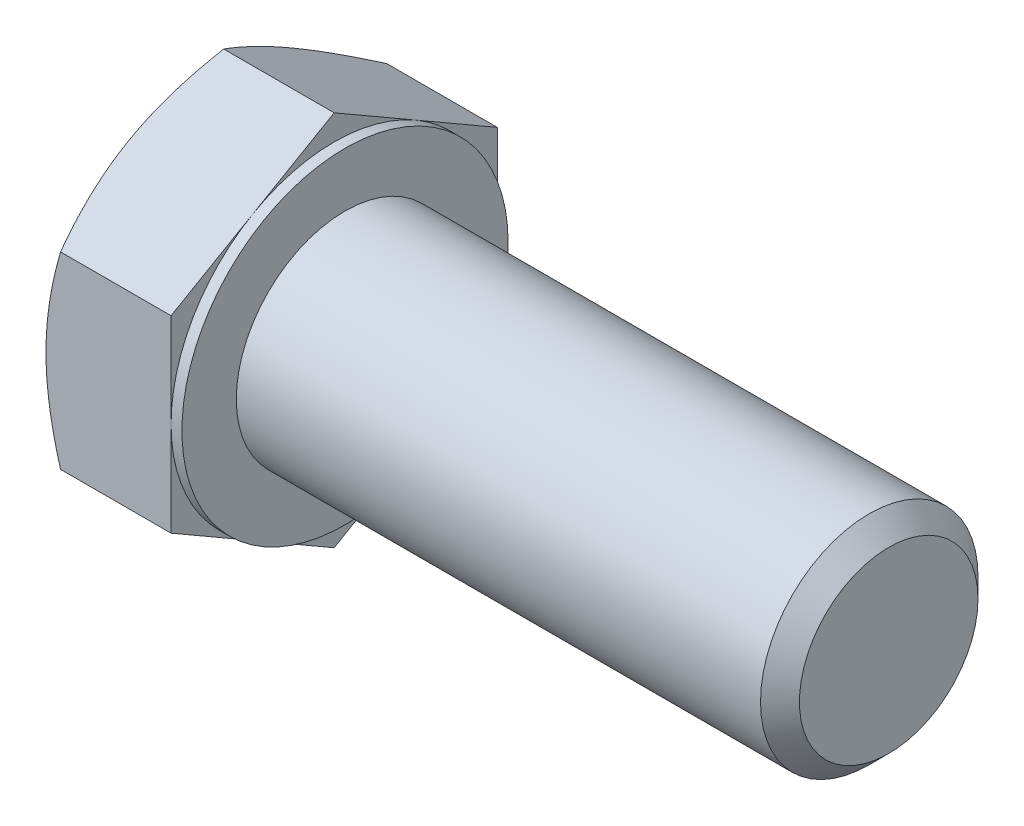
ISO-10303-21;
HEADER;
FILE_DESCRIPTION(('STEP AP214'),'2;1');
FILE_NAME('part.step','',(''),(''),'','','');
FILE_SCHEMA(('AUTOMOTIVE_DESIGN { 1 0 10303 214 1 1 1 1 }'));
ENDSEC;
DATA;
#1=APPLICATION_CONTEXT('core data for automotive mechanical design processes');
#2=APPLICATION_PROTOCOL_DEFINITION('international standard','automotive_design',2000,#1);
#3=PRODUCT_CONTEXT('',#1,'mechanical');
#4=PRODUCT('Part','Part','',(#3));
#5=PRODUCT_RELATED_PRODUCT_CATEGORY('part','',(#4));
#6=PRODUCT_DEFINITION_FORMATION('','',#4);
#7=PRODUCT_DEFINITION_CONTEXT('part definition',#1,'design');
#8=PRODUCT_DEFINITION('design','',#6,#7);
#9=PRODUCT_DEFINITION_SHAPE('','',#8);
#10=(LENGTH_UNIT() NAMED_UNIT(*) SI_UNIT(.MILLI.,.METRE.));
#11=(NAMED_UNIT(*) PLANE_ANGLE_UNIT() SI_UNIT($,.RADIAN.));
#12=(NAMED_UNIT(*) SI_UNIT($,.STERADIAN.) SOLID_ANGLE_UNIT());
#13=UNCERTAINTY_MEASURE_WITH_UNIT(LENGTH_MEASURE(1.E-05),#10,'distance_accuracy_value','');
#14=(GEOMETRIC_REPRESENTATION_CONTEXT(3) GLOBAL_UNCERTAINTY_ASSIGNED_CONTEXT((#13)) GLOBAL_UNIT_ASSIGNED_CONTEXT((#10,
#11,#12)) REPRESENTATION_CONTEXT('',''));
#15=CARTESIAN_POINT('',(0.,0.,0.));
#16=DIRECTION('',(0.,0.,1.));
#17=DIRECTION('',(1.,0.,0.));
#18=AXIS2_PLACEMENT_3D('',#15,#16,#17);
#19=CARTESIAN_POINT('',(-0.600100000000001,0.,0.));
#20=DIRECTION('',(-1.,0.,0.));
#21=DIRECTION('',(0.,0.,1.));
#22=AXIS2_PLACEMENT_3D('',#19,#20,#21);
#23=PLANE('',#22);
#24=CARTESIAN_POINT('',(-0.600100000000001,0.,0.));
#25=DIRECTION('',(1.,0.,0.));
#26=DIRECTION('',(0.,0.,-1.));
#27=AXIS2_PLACEMENT_3D('',#24,#25,#26);
#28=CIRCLE('',#27,9.);
#29=CARTESIAN_POINT('',(-0.600100000000001,0.,-9.));
#30=VERTEX_POINT('',#29);
#31=CARTESIAN_POINT('',(-0.600100000000001,7.79422863405995,-4.50000000000003));
#32=VERTEX_POINT('',#31);
#33=EDGE_CURVE('E179',#30,#32,#28,.T.);
#34=ORIENTED_EDGE('',*,*,#33,.F.);
#35=DIRECTION('',(0.,1.,0.));
#36=VECTOR('',#35,1.);
#37=CARTESIAN_POINT('',(-0.600100000000001,5.19615242270663,-9.));
#38=LINE('',#37,#36);
#39=CARTESIAN_POINT('',(-0.600100000000001,5.19615242270663,-9.));
#40=VERTEX_POINT('',#39);
#41=EDGE_CURVE('E167',#30,#40,#38,.T.);
#42=ORIENTED_EDGE('',*,*,#41,.T.);
#43=DIRECTION('',(0.,0.500000000000002,0.866025403784437));
#44=VECTOR('',#43,1.);
#45=CARTESIAN_POINT('',(-0.600100000000001,10.3923048454133,0.));
#46=LINE('',#45,#44);
#47=EDGE_CURVE('E180',#40,#32,#46,.T.);
#48=ORIENTED_EDGE('',*,*,#47,.T.);
#49=EDGE_LOOP('',(#34,#42,#48));
#50=FACE_BOUND('',#49,.T.);
#51=ADVANCED_FACE('F58',(#50),#23,.F.);
#52=CARTESIAN_POINT('',(-0.600100000000001,7.79422863405994,4.50000000000004));
#53=VERTEX_POINT('',#52);
#54=EDGE_CURVE('E74',#32,#53,#28,.T.);
#55=ORIENTED_EDGE('',*,*,#54,.F.);
#56=CARTESIAN_POINT('',(-0.600100000000001,10.3923048454133,0.));
#57=VERTEX_POINT('',#56);
#58=EDGE_CURVE('E166',#32,#57,#46,.T.);
#59=ORIENTED_EDGE('',*,*,#58,.T.);
#60=DIRECTION('',(0.,-0.500000000000004,0.866025403784436));
#61=VECTOR('',#60,1.);
#62=CARTESIAN_POINT('',(-0.600100000000001,5.19615242270662,9.));
#63=LINE('',#62,#61);
#64=EDGE_CURVE('E198',#57,#53,#63,.T.);
#65=ORIENTED_EDGE('',*,*,#64,.T.);
#66=EDGE_LOOP('',(#55,#59,#65));
#67=FACE_BOUND('',#66,.T.);
#68=ADVANCED_FACE('F468',(#67),#23,.F.);
#69=CARTESIAN_POINT('',(-0.600100000000001,0.,9.));
#70=VERTEX_POINT('',#69);
#71=EDGE_CURVE('E472',#53,#70,#28,.T.);
#72=ORIENTED_EDGE('',*,*,#71,.F.);
#73=CARTESIAN_POINT('',(-0.600100000000001,5.19615242270662,9.));
#74=VERTEX_POINT('',#73);
#75=EDGE_CURVE('E182',#53,#74,#63,.T.);
#76=ORIENTED_EDGE('',*,*,#75,.T.);
#77=DIRECTION('',(0.,-1.,0.));
#78=VECTOR('',#77,1.);
#79=CARTESIAN_POINT('',(-0.600099999999999,-5.19615242270663,9.));
#80=LINE('',#79,#78);
#81=EDGE_CURVE('E201',#74,#70,#80,.T.);
#82=ORIENTED_EDGE('',*,*,#81,.T.);
#83=EDGE_LOOP('',(#72,#76,#82));
#84=FACE_BOUND('',#83,.T.);
#85=ADVANCED_FACE('F484',(#84),#23,.F.);
#86=CARTESIAN_POINT('',(-0.600100000000001,-7.79422863405995,4.50000000000003));
#87=VERTEX_POINT('',#86);
#88=EDGE_CURVE('E191',#70,#87,#28,.T.);
#89=ORIENTED_EDGE('',*,*,#88,.F.);
#90=CARTESIAN_POINT('',(-0.600099999999999,-5.19615242270663,9.));
#91=VERTEX_POINT('',#90);
#92=EDGE_CURVE('E200',#70,#91,#80,.T.);
#93=ORIENTED_EDGE('',*,*,#92,.T.);
#94=DIRECTION('',(0.,-0.500000000000002,-0.866025403784437));
#95=VECTOR('',#94,1.);
#96=CARTESIAN_POINT('',(-0.600099999999999,-10.3923048454133,0.));
#97=LINE('',#96,#95);
#98=EDGE_CURVE('E205',#91,#87,#97,.T.);
#99=ORIENTED_EDGE('',*,*,#98,.T.);
#100=EDGE_LOOP('',(#89,#93,#99));
#101=FACE_BOUND('',#100,.T.);
#102=ADVANCED_FACE('F476',(#101),#23,.F.);
#103=CARTESIAN_POINT('',(-0.600100000000001,-7.79422863405994,-4.50000000000004));
#104=VERTEX_POINT('',#103);
#105=EDGE_CURVE('E189',#87,#104,#28,.T.);
#106=ORIENTED_EDGE('',*,*,#105,.F.);
#107=CARTESIAN_POINT('',(-0.600099999999999,-10.3923048454133,0.));
#108=VERTEX_POINT('',#107);
#109=EDGE_CURVE('E204',#87,#108,#97,.T.);
#110=ORIENTED_EDGE('',*,*,#109,.T.);
#111=DIRECTION('',(0.,0.500000000000004,-0.866025403784437));
#112=VECTOR('',#111,1.);
#113=CARTESIAN_POINT('',(-0.600099999999999,-5.19615242270662,-9.));
#114=LINE('',#113,#112);
#115=EDGE_CURVE('E177',#108,#104,#114,.T.);
#116=ORIENTED_EDGE('',*,*,#115,.T.);
#117=EDGE_LOOP('',(#106,#110,#116));
#118=FACE_BOUND('',#117,.T.);
#119=ADVANCED_FACE('F546',(#118),#23,.F.);
#120=CARTESIAN_POINT('',(-0.600099999999993,-10.3923048454133,0.));
#121=DIRECTION('',(0.,-0.866025403784438,-0.5));
#122=DIRECTION('',(0.,0.5,-0.866025403784438));
#123=AXIS2_PLACEMENT_3D('',#120,#121,#122);
#124=PLANE('',#123);
#125=CARTESIAN_POINT('',(-7.5001,-7.79422863405994,-4.5));
#126=CARTESIAN_POINT('',(-7.50010000000001,-6.58845726811989,-6.58845726811988));
#127=CARTESIAN_POINT('',(-6.69625242270666,-5.19615242270663,-9.));
#128=(BOUNDED_CURVE() B_SPLINE_CURVE(2,(#125,#126,#127),.UNSPECIFIED.,.F.,
.F.) B_SPLINE_CURVE_WITH_KNOTS((3,3),(0.527138746897715,1.05427749379543),
.UNSPECIFIED.) CURVE() GEOMETRIC_REPRESENTATION_ITEM() RATIONAL_B_SPLINE_CURVE((1.,
1.03795484930204,1.)) REPRESENTATION_ITEM(''));
#129=CARTESIAN_POINT('',(-7.5001,-7.79422863405994,-4.5));
#130=VERTEX_POINT('',#129);
#131=CARTESIAN_POINT('',(-6.69625242270666,-5.19615242270664,-9.));
#132=VERTEX_POINT('',#131);
#133=EDGE_CURVE('E193',#130,#132,#128,.T.);
#134=ORIENTED_EDGE('',*,*,#133,.T.);
#135=DIRECTION('',(-1.,0.,0.));
#136=VECTOR('',#135,1.);
#137=CARTESIAN_POINT('',(-0.600099999999999,-5.19615242270662,-9.));
#138=LINE('',#137,#136);
#139=CARTESIAN_POINT('',(-0.600099999999999,-5.19615242270662,-9.));
#140=VERTEX_POINT('',#139);
#141=EDGE_CURVE('E215',#140,#132,#138,.T.);
#142=ORIENTED_EDGE('',*,*,#141,.F.);
#143=EDGE_CURVE('E162',#104,#140,#114,.T.);
#144=ORIENTED_EDGE('',*,*,#143,.F.);
#145=ORIENTED_EDGE('',*,*,#115,.F.);
#146=DIRECTION('',(-1.,0.,0.));
#147=VECTOR('',#146,1.);
#148=CARTESIAN_POINT('',(-0.600099999999999,-10.3923048454133,0.));
#149=LINE('',#148,#147);
#150=CARTESIAN_POINT('',(-6.69625242270665,-10.3923048454133,0.));
#151=VERTEX_POINT('',#150);
#152=EDGE_CURVE('E217',#108,#151,#149,.T.);
#153=ORIENTED_EDGE('',*,*,#152,.T.);
#154=CARTESIAN_POINT('',(-6.69625242270666,-10.3923048454132,0.));
#155=CARTESIAN_POINT('',(-7.50010000000001,-8.99999999999998,-2.41154273188012));
#156=CARTESIAN_POINT('',(-7.5001,-7.79422863405994,-4.5));
#157=(BOUNDED_CURVE() B_SPLINE_CURVE(2,(#154,#155,#156),.UNSPECIFIED.,.F.,
.F.) B_SPLINE_CURVE_WITH_KNOTS((3,3),(0.,0.527138746897715),
.UNSPECIFIED.) CURVE() GEOMETRIC_REPRESENTATION_ITEM() RATIONAL_B_SPLINE_CURVE((1.,
1.03795484930204,1.)) REPRESENTATION_ITEM(''));
#158=EDGE_CURVE('E310',#151,#130,#157,.T.);
#159=ORIENTED_EDGE('',*,*,#158,.T.);
#160=EDGE_LOOP('',(#134,#142,#144,#145,#153,#159));
#161=FACE_BOUND('',#160,.T.);
#162=ADVANCED_FACE('F538',(#161),#124,.T.);
#163=CARTESIAN_POINT('',(-0.6001,-5.19615242270663,9.));
#164=DIRECTION('',(0.,-0.866025403784439,0.5));
#165=DIRECTION('',(-1.,0.,0.));
#166=AXIS2_PLACEMENT_3D('',#163,#164,#165);
#167=PLANE('',#166);
#168=CARTESIAN_POINT('',(-7.5001,-7.79422863405995,4.5));
#169=CARTESIAN_POINT('',(-7.50010000000002,-8.99999999999999,2.4115427318801));
#170=CARTESIAN_POINT('',(-6.69625242270666,-10.3923048454132,0.));
#171=(BOUNDED_CURVE() B_SPLINE_CURVE(2,(#168,#169,#170),.UNSPECIFIED.,.F.,
.F.) B_SPLINE_CURVE_WITH_KNOTS((3,3),(0.527138746897716,1.05427749379543),
.UNSPECIFIED.) CURVE() GEOMETRIC_REPRESENTATION_ITEM() RATIONAL_B_SPLINE_CURVE((1.,
1.03795484930203,1.)) REPRESENTATION_ITEM(''));
#172=CARTESIAN_POINT('',(-7.5001,-7.79422863405995,4.5));
#173=VERTEX_POINT('',#172);
#174=EDGE_CURVE('E317',#173,#151,#171,.T.);
#175=ORIENTED_EDGE('',*,*,#174,.T.);
#176=ORIENTED_EDGE('',*,*,#152,.F.);
#177=ORIENTED_EDGE('',*,*,#109,.F.);
#178=ORIENTED_EDGE('',*,*,#98,.F.);
#179=DIRECTION('',(-1.,0.,0.));
#180=VECTOR('',#179,1.);
#181=CARTESIAN_POINT('',(-0.600099999999999,-5.19615242270663,9.));
#182=LINE('',#181,#180);
#183=CARTESIAN_POINT('',(-6.69625242270666,-5.19615242270663,9.));
#184=VERTEX_POINT('',#183);
#185=EDGE_CURVE('E220',#91,#184,#182,.T.);
#186=ORIENTED_EDGE('',*,*,#185,.T.);
#187=CARTESIAN_POINT('',(-6.69625242270666,-5.19615242270665,9.));
#188=CARTESIAN_POINT('',(-7.50010000000001,-6.5884572681199,6.58845726811988));
#189=CARTESIAN_POINT('',(-7.5001,-7.79422863405995,4.5));
#190=(BOUNDED_CURVE() B_SPLINE_CURVE(2,(#187,#188,#189),.UNSPECIFIED.,.F.,
.F.) B_SPLINE_CURVE_WITH_KNOTS((3,3),(0.,0.527138746897716),
.UNSPECIFIED.) CURVE() GEOMETRIC_REPRESENTATION_ITEM() RATIONAL_B_SPLINE_CURVE((1.,
1.03795484930204,1.)) REPRESENTATION_ITEM(''));
#191=EDGE_CURVE('E234',#184,#173,#190,.T.);
#192=ORIENTED_EDGE('',*,*,#191,.T.);
#193=EDGE_LOOP('',(#175,#176,#177,#178,#186,#192));
#194=FACE_BOUND('',#193,.T.);
#195=ADVANCED_FACE('F530',(#194),#167,.T.);
#196=CARTESIAN_POINT('',(-0.6001,5.19615242270662,9.));
#197=DIRECTION('',(0.,0.,1.));
#198=DIRECTION('',(0.,-1.,0.));
#199=AXIS2_PLACEMENT_3D('',#196,#197,#198);
#200=PLANE('',#199);
#201=CARTESIAN_POINT('',(-7.5001,0.,9.));
#202=CARTESIAN_POINT('',(-7.50010000000003,-2.41154273188009,8.99999999999999));
#203=CARTESIAN_POINT('',(-6.69625242270665,-5.19615242270661,9.));
#204=(BOUNDED_CURVE() B_SPLINE_CURVE(2,(#201,#202,#203),.UNSPECIFIED.,.F.,
.F.) B_SPLINE_CURVE_WITH_KNOTS((3,3),(0.527138746897716,1.05427749379543),
.UNSPECIFIED.) CURVE() GEOMETRIC_REPRESENTATION_ITEM() RATIONAL_B_SPLINE_CURVE((1.,
1.03795484930205,1.)) REPRESENTATION_ITEM(''));
#205=CARTESIAN_POINT('',(-7.5001,0.,9.));
#206=VERTEX_POINT('',#205);
#207=EDGE_CURVE('E227',#206,#184,#204,.T.);
#208=ORIENTED_EDGE('',*,*,#207,.T.);
#209=ORIENTED_EDGE('',*,*,#185,.F.);
#210=ORIENTED_EDGE('',*,*,#92,.F.);
#211=ORIENTED_EDGE('',*,*,#81,.F.);
#212=DIRECTION('',(-1.,0.,0.));
#213=VECTOR('',#212,1.);
#214=CARTESIAN_POINT('',(-0.600100000000001,5.19615242270662,9.));
#215=LINE('',#214,#213);
#216=CARTESIAN_POINT('',(-6.69625242270666,5.19615242270662,9.));
#217=VERTEX_POINT('',#216);
#218=EDGE_CURVE('E223',#74,#217,#215,.T.);
#219=ORIENTED_EDGE('',*,*,#218,.T.);
#220=CARTESIAN_POINT('',(-6.69625242270666,5.1961524227066,9.));
#221=CARTESIAN_POINT('',(-7.50010000000001,2.41154273188008,8.99999999999999));
#222=CARTESIAN_POINT('',(-7.5001,0.,9.));
#223=(BOUNDED_CURVE() B_SPLINE_CURVE(2,(#220,#221,#222),.UNSPECIFIED.,.F.,
.F.) B_SPLINE_CURVE_WITH_KNOTS((3,3),(0.,0.527138746897716),
.UNSPECIFIED.) CURVE() GEOMETRIC_REPRESENTATION_ITEM() RATIONAL_B_SPLINE_CURVE((1.,
1.03795484930204,1.)) REPRESENTATION_ITEM(''));
#224=EDGE_CURVE('E255',#217,#206,#223,.T.);
#225=ORIENTED_EDGE('',*,*,#224,.T.);
#226=EDGE_LOOP('',(#208,#209,#210,#211,#219,#225));
#227=FACE_BOUND('',#226,.T.);
#228=ADVANCED_FACE('F481',(#227),#200,.T.);
#229=CARTESIAN_POINT('',(-0.6001,10.3923048454133,0.));
#230=DIRECTION('',(0.,0.866025403784438,0.5));
#231=DIRECTION('',(1.,0.,0.));
#232=AXIS2_PLACEMENT_3D('',#229,#230,#231);
#233=PLANE('',#232);
#234=CARTESIAN_POINT('',(-7.5001,7.79422863405994,4.5));
#235=CARTESIAN_POINT('',(-7.50010000000001,6.58845726811989,6.58845726811989));
#236=CARTESIAN_POINT('',(-6.69625242270666,5.19615242270664,9.));
#237=(BOUNDED_CURVE() B_SPLINE_CURVE(2,(#234,#235,#236),.UNSPECIFIED.,.F.,
.F.) B_SPLINE_CURVE_WITH_KNOTS((3,3),(0.527138746897715,1.05427749379543),
.UNSPECIFIED.) CURVE() GEOMETRIC_REPRESENTATION_ITEM() RATIONAL_B_SPLINE_CURVE((1.,
1.03795484930204,1.)) REPRESENTATION_ITEM(''));
#238=CARTESIAN_POINT('',(-7.5001,7.79422863405994,4.5));
#239=VERTEX_POINT('',#238);
#240=EDGE_CURVE('E226',#239,#217,#237,.T.);
#241=ORIENTED_EDGE('',*,*,#240,.T.);
#242=ORIENTED_EDGE('',*,*,#218,.F.);
#243=ORIENTED_EDGE('',*,*,#75,.F.);
#244=ORIENTED_EDGE('',*,*,#64,.F.);
#245=DIRECTION('',(-1.,0.,0.));
#246=VECTOR('',#245,1.);
#247=CARTESIAN_POINT('',(-0.600100000000001,10.3923048454133,0.));
#248=LINE('',#247,#246);
#249=CARTESIAN_POINT('',(-6.69625242270666,10.3923048454133,0.));
#250=VERTEX_POINT('',#249);
#251=EDGE_CURVE('E211',#57,#250,#248,.T.);
#252=ORIENTED_EDGE('',*,*,#251,.T.);
#253=CARTESIAN_POINT('',(-6.69625242270666,10.3923048454132,0.));
#254=CARTESIAN_POINT('',(-7.50010000000002,8.99999999999999,2.41154273188012));
#255=CARTESIAN_POINT('',(-7.5001,7.79422863405994,4.5));
#256=(BOUNDED_CURVE() B_SPLINE_CURVE(2,(#253,#254,#255),.UNSPECIFIED.,.F.,
.F.) B_SPLINE_CURVE_WITH_KNOTS((3,3),(0.,0.527138746897715),
.UNSPECIFIED.) CURVE() GEOMETRIC_REPRESENTATION_ITEM() RATIONAL_B_SPLINE_CURVE((1.,
1.03795484930205,1.)) REPRESENTATION_ITEM(''));
#257=EDGE_CURVE('E318',#250,#239,#256,.T.);
#258=ORIENTED_EDGE('',*,*,#257,.T.);
#259=EDGE_LOOP('',(#241,#242,#243,#244,#252,#258));
#260=FACE_BOUND('',#259,.T.);
#261=ADVANCED_FACE('F486',(#260),#233,.T.);
#262=CARTESIAN_POINT('',(-0.6001,5.19615242270663,-9.));
#263=DIRECTION('',(0.,0.866025403784439,-0.5));
#264=DIRECTION('',(-1.,0.,0.));
#265=AXIS2_PLACEMENT_3D('',#262,#263,#264);
#266=PLANE('',#265);
#267=CARTESIAN_POINT('',(-7.5001,7.79422863405994,-4.5));
#268=CARTESIAN_POINT('',(-7.50010000000002,8.99999999999999,-2.41154273188011));
#269=CARTESIAN_POINT('',(-6.69625242270666,10.3923048454132,0.));
#270=(BOUNDED_CURVE() B_SPLINE_CURVE(2,(#267,#268,#269),.UNSPECIFIED.,.F.,
.F.) B_SPLINE_CURVE_WITH_KNOTS((3,3),(0.527138746897716,1.05427749379543),
.UNSPECIFIED.) CURVE() GEOMETRIC_REPRESENTATION_ITEM() RATIONAL_B_SPLINE_CURVE((1.,
1.03795484930204,1.)) REPRESENTATION_ITEM(''));
#271=CARTESIAN_POINT('',(-7.5001,7.79422863405994,-4.5));
#272=VERTEX_POINT('',#271);
#273=EDGE_CURVE('E293',#272,#250,#270,.T.);
#274=ORIENTED_EDGE('',*,*,#273,.T.);
#275=ORIENTED_EDGE('',*,*,#251,.F.);
#276=ORIENTED_EDGE('',*,*,#58,.F.);
#277=ORIENTED_EDGE('',*,*,#47,.F.);
#278=DIRECTION('',(-1.,0.,0.));
#279=VECTOR('',#278,1.);
#280=CARTESIAN_POINT('',(-0.600100000000001,5.19615242270663,-9.));
#281=LINE('',#280,#279);
#282=CARTESIAN_POINT('',(-6.69625242270666,5.19615242270663,-9.));
#283=VERTEX_POINT('',#282);
#284=EDGE_CURVE('E173',#40,#283,#281,.T.);
#285=ORIENTED_EDGE('',*,*,#284,.T.);
#286=CARTESIAN_POINT('',(-6.69625242270666,5.19615242270664,-9.));
#287=CARTESIAN_POINT('',(-7.50010000000001,6.5884572681199,-6.58845726811988));
#288=CARTESIAN_POINT('',(-7.5001,7.79422863405994,-4.5));
#289=(BOUNDED_CURVE() B_SPLINE_CURVE(2,(#286,#287,#288),.UNSPECIFIED.,.F.,
.F.) B_SPLINE_CURVE_WITH_KNOTS((3,3),(0.,0.527138746897716),
.UNSPECIFIED.) CURVE() GEOMETRIC_REPRESENTATION_ITEM() RATIONAL_B_SPLINE_CURVE((1.,
1.03795484930204,1.)) REPRESENTATION_ITEM(''));
#290=EDGE_CURVE('E425',#283,#272,#289,.T.);
#291=ORIENTED_EDGE('',*,*,#290,.T.);
#292=EDGE_LOOP('',(#274,#275,#276,#277,#285,#291));
#293=FACE_BOUND('',#292,.T.);
#294=ADVANCED_FACE('F465',(#293),#266,.T.);
#295=CARTESIAN_POINT('',(-0.6001,-5.19615242270662,-9.));
#296=DIRECTION('',(0.,0.,-1.));
#297=DIRECTION('',(-1.,0.,0.));
#298=AXIS2_PLACEMENT_3D('',#295,#296,#297);
#299=PLANE('',#298);
#300=CARTESIAN_POINT('',(-7.5001,0.,-9.));
#301=CARTESIAN_POINT('',(-7.50010000000002,2.41154273188008,-8.99999999999999));
#302=CARTESIAN_POINT('',(-6.69625242270666,5.1961524227066,-9.));
#303=(BOUNDED_CURVE() B_SPLINE_CURVE(2,(#300,#301,#302),.UNSPECIFIED.,.F.,
.F.) B_SPLINE_CURVE_WITH_KNOTS((3,3),(0.527138746897715,1.05427749379543),
.UNSPECIFIED.) CURVE() GEOMETRIC_REPRESENTATION_ITEM() RATIONAL_B_SPLINE_CURVE((1.,
1.03795484930203,1.)) REPRESENTATION_ITEM(''));
#304=CARTESIAN_POINT('',(-7.5001,0.,-9.));
#305=VERTEX_POINT('',#304);
#306=EDGE_CURVE('E273',#305,#283,#303,.T.);
#307=ORIENTED_EDGE('',*,*,#306,.T.);
#308=ORIENTED_EDGE('',*,*,#284,.F.);
#309=ORIENTED_EDGE('',*,*,#41,.F.);
#310=EDGE_CURVE('E159',#140,#30,#38,.T.);
#311=ORIENTED_EDGE('',*,*,#310,.F.);
#312=ORIENTED_EDGE('',*,*,#141,.T.);
#313=CARTESIAN_POINT('',(-6.69625242270666,-5.1961524227066,-9.));
#314=CARTESIAN_POINT('',(-7.50010000000002,-2.41154273188008,-8.99999999999999));
#315=CARTESIAN_POINT('',(-7.5001,0.,-9.));
#316=(BOUNDED_CURVE() B_SPLINE_CURVE(2,(#313,#314,#315),.UNSPECIFIED.,.F.,
.F.) B_SPLINE_CURVE_WITH_KNOTS((3,3),(0.,0.527138746897715),
.UNSPECIFIED.) CURVE() GEOMETRIC_REPRESENTATION_ITEM() RATIONAL_B_SPLINE_CURVE((1.,
1.03795484930202,1.)) REPRESENTATION_ITEM(''));
#317=EDGE_CURVE('E417',#132,#305,#316,.T.);
#318=ORIENTED_EDGE('',*,*,#317,.T.);
#319=EDGE_LOOP('',(#307,#308,#309,#311,#312,#318));
#320=FACE_BOUND('',#319,.T.);
#321=ADVANCED_FACE('F171',(#320),#299,.T.);
#322=CARTESIAN_POINT('',(-7.5001,0.,0.));
#323=DIRECTION('',(1.,0.,0.));
#324=DIRECTION('',(0.,1.,0.));
#325=AXIS2_PLACEMENT_3D('',#322,#323,#324);
#326=PLANE('',#325);
#327=CARTESIAN_POINT('',(-7.5001,0.,0.));
#328=DIRECTION('',(-1.,0.,0.));
#329=DIRECTION('',(0.,1.,0.));
#330=AXIS2_PLACEMENT_3D('',#327,#328,#329);
#331=CIRCLE('',#330,9.);
#332=EDGE_CURVE('E262',#206,#239,#331,.T.);
#333=ORIENTED_EDGE('',*,*,#332,.T.);
#334=CARTESIAN_POINT('',(-7.5001,0.,0.));
#335=DIRECTION('',(-1.,0.,0.));
#336=DIRECTION('',(0.,1.,0.));
#337=AXIS2_PLACEMENT_3D('',#334,#335,#336);
#338=CIRCLE('',#337,9.);
#339=EDGE_CURVE('E300',#239,#272,#338,.T.);
#340=ORIENTED_EDGE('',*,*,#339,.T.);
#341=CARTESIAN_POINT('',(-7.5001,0.,0.));
#342=DIRECTION('',(-1.,0.,0.));
#343=DIRECTION('',(0.,1.,0.));
#344=AXIS2_PLACEMENT_3D('',#341,#342,#343);
#345=CIRCLE('',#344,9.);
#346=EDGE_CURVE('E446',#272,#305,#345,.T.);
#347=ORIENTED_EDGE('',*,*,#346,.T.);
#348=CARTESIAN_POINT('',(-7.5001,0.,0.));
#349=DIRECTION('',(-1.,0.,0.));
#350=DIRECTION('',(0.,1.,0.));
#351=AXIS2_PLACEMENT_3D('',#348,#349,#350);
#352=CIRCLE('',#351,9.);
#353=EDGE_CURVE('E190',#305,#130,#352,.T.);
#354=ORIENTED_EDGE('',*,*,#353,.T.);
#355=CARTESIAN_POINT('',(-7.5001,0.,0.));
#356=DIRECTION('',(-1.,0.,0.));
#357=DIRECTION('',(0.,1.,0.));
#358=AXIS2_PLACEMENT_3D('',#355,#356,#357);
#359=CIRCLE('',#358,9.);
#360=EDGE_CURVE('E322',#130,#173,#359,.T.);
#361=ORIENTED_EDGE('',*,*,#360,.T.);
#362=CARTESIAN_POINT('',(-7.5001,0.,0.));
#363=DIRECTION('',(-1.,0.,0.));
#364=DIRECTION('',(0.,1.,0.));
#365=AXIS2_PLACEMENT_3D('',#362,#363,#364);
#366=CIRCLE('',#365,9.);
#367=EDGE_CURVE('E233',#173,#206,#366,.T.);
#368=ORIENTED_EDGE('',*,*,#367,.T.);
#369=EDGE_LOOP('',(#333,#340,#347,#354,#361,#368));
#370=FACE_BOUND('',#369,.T.);
#371=ADVANCED_FACE('F507',(#370),#326,.F.);
#372=CARTESIAN_POINT('',(-7.09817621135333,0.,0.));
#373=DIRECTION('',(1.,0.,0.));
#374=DIRECTION('',(0.,1.,0.));
#375=AXIS2_PLACEMENT_3D('',#372,#373,#374);
#376=CONICAL_SURFACE('',#375,9.69615242270662,1.0471975512);
#377=ORIENTED_EDGE('',*,*,#317,.F.);
#378=ORIENTED_EDGE('',*,*,#133,.F.);
#379=ORIENTED_EDGE('',*,*,#353,.F.);
#380=EDGE_LOOP('',(#377,#378,#379));
#381=FACE_BOUND('',#380,.T.);
#382=ADVANCED_FACE('F617',(#381),#376,.T.);
#383=CARTESIAN_POINT('',(-7.09817621135333,0.,0.));
#384=DIRECTION('',(1.,0.,0.));
#385=DIRECTION('',(0.,1.,0.));
#386=AXIS2_PLACEMENT_3D('',#383,#384,#385);
#387=CONICAL_SURFACE('',#386,9.69615242270662,1.0471975512);
#388=ORIENTED_EDGE('',*,*,#306,.F.);
#389=ORIENTED_EDGE('',*,*,#346,.F.);
#390=ORIENTED_EDGE('',*,*,#290,.F.);
#391=EDGE_LOOP('',(#388,#389,#390));
#392=FACE_BOUND('',#391,.T.);
#393=ADVANCED_FACE('F463',(#392),#387,.T.);
#394=CARTESIAN_POINT('',(-7.09817621135333,0.,0.));
#395=DIRECTION('',(1.,0.,0.));
#396=DIRECTION('',(0.,1.,0.));
#397=AXIS2_PLACEMENT_3D('',#394,#395,#396);
#398=CONICAL_SURFACE('',#397,9.69615242270662,1.0471975512);
#399=ORIENTED_EDGE('',*,*,#158,.F.);
#400=ORIENTED_EDGE('',*,*,#174,.F.);
#401=ORIENTED_EDGE('',*,*,#360,.F.);
#402=EDGE_LOOP('',(#399,#400,#401));
#403=FACE_BOUND('',#402,.T.);
#404=ADVANCED_FACE('F594',(#403),#398,.T.);
#405=CARTESIAN_POINT('',(-7.09817621135333,0.,0.));
#406=DIRECTION('',(1.,0.,0.));
#407=DIRECTION('',(0.,1.,0.));
#408=AXIS2_PLACEMENT_3D('',#405,#406,#407);
#409=CONICAL_SURFACE('',#408,9.69615242270662,1.0471975512);
#410=ORIENTED_EDGE('',*,*,#273,.F.);
#411=ORIENTED_EDGE('',*,*,#339,.F.);
#412=ORIENTED_EDGE('',*,*,#257,.F.);
#413=EDGE_LOOP('',(#410,#411,#412));
#414=FACE_BOUND('',#413,.T.);
#415=ADVANCED_FACE('F582',(#414),#409,.T.);
#416=CARTESIAN_POINT('',(-7.09817621135333,0.,0.));
#417=DIRECTION('',(1.,0.,0.));
#418=DIRECTION('',(0.,1.,0.));
#419=AXIS2_PLACEMENT_3D('',#416,#417,#418);
#420=CONICAL_SURFACE('',#419,9.69615242270662,1.0471975512);
#421=ORIENTED_EDGE('',*,*,#191,.F.);
#422=ORIENTED_EDGE('',*,*,#207,.F.);
#423=ORIENTED_EDGE('',*,*,#367,.F.);
#424=EDGE_LOOP('',(#421,#422,#423));
#425=FACE_BOUND('',#424,.T.);
#426=ADVANCED_FACE('F571',(#425),#420,.T.);
#427=CARTESIAN_POINT('',(-7.09817621135333,0.,0.));
#428=DIRECTION('',(1.,0.,0.));
#429=DIRECTION('',(0.,1.,0.));
#430=AXIS2_PLACEMENT_3D('',#427,#428,#429);
#431=CONICAL_SURFACE('',#430,9.69615242270662,1.0471975512);
#432=ORIENTED_EDGE('',*,*,#240,.F.);
#433=ORIENTED_EDGE('',*,*,#332,.F.);
#434=ORIENTED_EDGE('',*,*,#224,.F.);
#435=EDGE_LOOP('',(#432,#433,#434));
#436=FACE_BOUND('',#435,.T.);
#437=ADVANCED_FACE('F493',(#436),#431,.T.);
#438=EDGE_CURVE('E82',#104,#30,#28,.T.);
#439=ORIENTED_EDGE('',*,*,#438,.F.);
#440=ORIENTED_EDGE('',*,*,#143,.T.);
#441=ORIENTED_EDGE('',*,*,#310,.T.);
#442=EDGE_LOOP('',(#439,#440,#441));
#443=FACE_BOUND('',#442,.T.);
#444=ADVANCED_FACE('F161',(#443),#23,.F.);
#445=CARTESIAN_POINT('',(-0.6001,0.,0.));
#446=DIRECTION('',(1.,0.,0.));
#447=DIRECTION('',(0.,0.,-1.));
#448=AXIS2_PLACEMENT_3D('',#445,#446,#447);
#449=CYLINDRICAL_SURFACE('',#448,9.);
#450=ORIENTED_EDGE('',*,*,#33,.T.);
#451=ORIENTED_EDGE('',*,*,#54,.T.);
#452=ORIENTED_EDGE('',*,*,#71,.T.);
#453=ORIENTED_EDGE('',*,*,#88,.T.);
#454=ORIENTED_EDGE('',*,*,#105,.T.);
#455=ORIENTED_EDGE('',*,*,#438,.T.);
#456=EDGE_LOOP('',(#450,#451,#452,#453,#454,#455));
#457=FACE_BOUND('',#456,.T.);
#458=CARTESIAN_POINT('',(0.,0.,0.));
#459=DIRECTION('',(1.,0.,0.));
#460=DIRECTION('',(0.,0.,-1.));
#461=AXIS2_PLACEMENT_3D('',#458,#459,#460);
#462=CIRCLE('',#461,9.);
#463=CARTESIAN_POINT('',(0.,0.,-9.));
#464=VERTEX_POINT('',#463);
#465=EDGE_CURVE('E766',#464,#464,#462,.T.);
#466=ORIENTED_EDGE('',*,*,#465,.F.);
#467=EDGE_LOOP('',(#466));
#468=FACE_BOUND('',#467,.T.);
#469=ADVANCED_FACE('F186',(#457,#468),#449,.T.);
#470=CARTESIAN_POINT('',(30.,0.,0.));
#471=DIRECTION('',(1.,0.,0.));
#472=DIRECTION('',(0.,0.,-1.));
#473=AXIS2_PLACEMENT_3D('',#470,#471,#472);
#474=PLANE('',#473);
#475=CARTESIAN_POINT('',(30.,0.,0.));
#476=DIRECTION('',(1.,0.,0.));
#477=DIRECTION('',(0.,0.,-1.));
#478=AXIS2_PLACEMENT_3D('',#475,#476,#477);
#479=CIRCLE('',#478,4.92646249999726);
#480=CARTESIAN_POINT('',(30.,0.,-4.92646249999726));
#481=VERTEX_POINT('',#480);
#482=EDGE_CURVE('E67',#481,#481,#479,.T.);
#483=ORIENTED_EDGE('',*,*,#482,.T.);
#484=EDGE_LOOP('',(#483));
#485=FACE_BOUND('',#484,.T.);
#486=ADVANCED_FACE('F719',(#485),#474,.T.);
#487=CARTESIAN_POINT('',(-0.6001,0.,0.));
#488=DIRECTION('',(1.,0.,0.));
#489=DIRECTION('',(0.,0.,-1.));
#490=AXIS2_PLACEMENT_3D('',#487,#488,#489);
#491=CYLINDRICAL_SURFACE('',#490,6.);
#492=CARTESIAN_POINT('',(28.9263625000027,0.,0.));
#493=DIRECTION('',(1.,0.,0.));
#494=DIRECTION('',(0.,0.,-1.));
#495=AXIS2_PLACEMENT_3D('',#492,#493,#494);
#496=CIRCLE('',#495,6.);
#497=CARTESIAN_POINT('',(28.9263625000027,0.,-6.));
#498=VERTEX_POINT('',#497);
#499=EDGE_CURVE('E12',#498,#498,#496,.F.);
#500=ORIENTED_EDGE('',*,*,#499,.T.);
#501=EDGE_LOOP('',(#500));
#502=FACE_BOUND('',#501,.T.);
#503=CARTESIAN_POINT('',(0.,0.,0.));
#504=DIRECTION('',(1.,0.,0.));
#505=DIRECTION('',(0.,0.,-1.));
#506=AXIS2_PLACEMENT_3D('',#503,#504,#505);
#507=CIRCLE('',#506,6.);
#508=CARTESIAN_POINT('',(0.,0.,-6.));
#509=VERTEX_POINT('',#508);
#510=EDGE_CURVE('E183',#509,#509,#507,.T.);
#511=ORIENTED_EDGE('',*,*,#510,.T.);
#512=EDGE_LOOP('',(#511));
#513=FACE_BOUND('',#512,.T.);
#514=ADVANCED_FACE('F729',(#502,#513),#491,.T.);
#515=CARTESIAN_POINT('',(0.,6.,0.));
#516=DIRECTION('',(1.,0.,0.));
#517=DIRECTION('',(0.,0.,-1.));
#518=AXIS2_PLACEMENT_3D('',#515,#516,#517);
#519=PLANE('',#518);
#520=ORIENTED_EDGE('',*,*,#465,.T.);
#521=EDGE_LOOP('',(#520));
#522=FACE_BOUND('',#521,.T.);
#523=ORIENTED_EDGE('',*,*,#510,.F.);
#524=EDGE_LOOP('',(#523));
#525=FACE_BOUND('',#524,.T.);
#526=ADVANCED_FACE('F739',(#522,#525),#519,.T.);
#527=CARTESIAN_POINT('',(30.,0.,0.));
#528=DIRECTION('',(-1.,0.,0.));
#529=DIRECTION('',(0.,0.,1.));
#530=AXIS2_PLACEMENT_3D('',#527,#528,#529);
#531=CONICAL_SURFACE('',#530,4.92646249999726,0.785351590577605);
#532=ORIENTED_EDGE('',*,*,#499,.F.);
#533=EDGE_LOOP('',(#532));
#534=FACE_BOUND('',#533,.T.);
#535=ORIENTED_EDGE('',*,*,#482,.F.);
#536=EDGE_LOOP('',(#535));
#537=FACE_BOUND('',#536,.T.);
#538=ADVANCED_FACE('F61',(#534,#537),#531,.T.);
#539=CLOSED_SHELL('',(#51,#68,#85,#102,#119,#162,#195,#228,#261,#294,#321,#371,#382,#393,#404,
#415,#426,#437,#444,#469,#486,#514,#526,#538));
#540=MANIFOLD_SOLID_BREP('B2',#539);
#541=ADVANCED_BREP_SHAPE_REPRESENTATION('',(#18,#540),#14);
#542=SHAPE_DEFINITION_REPRESENTATION(#9,#541);
ENDSEC;
END-ISO-10303-21;
